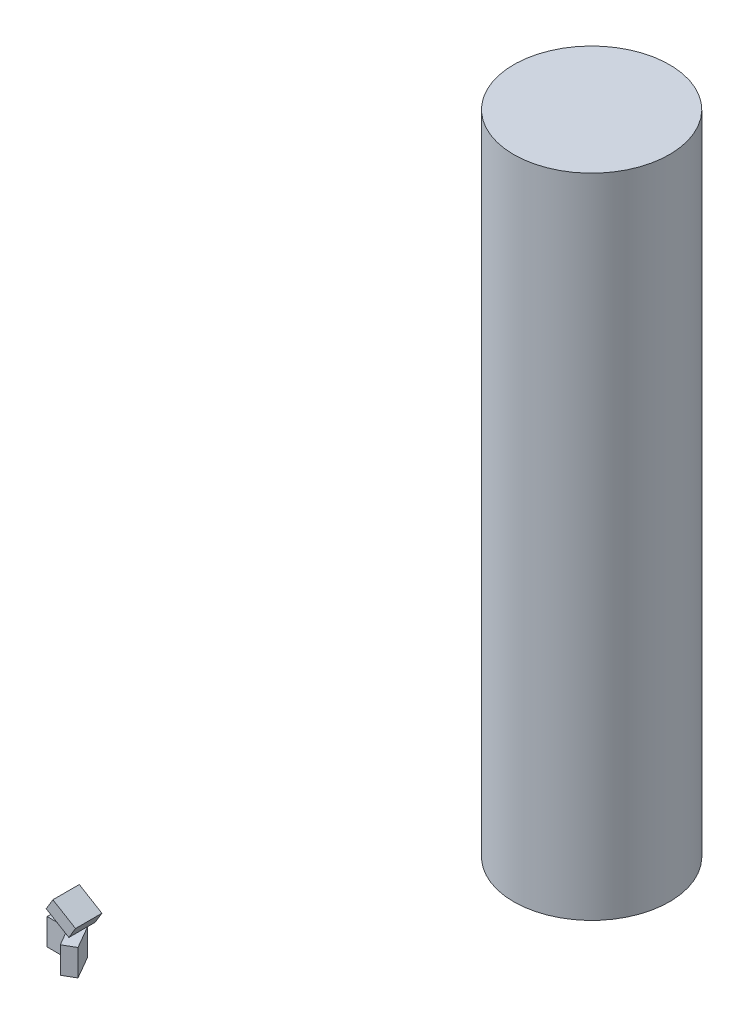
ISO-10303-21;
HEADER;
FILE_DESCRIPTION(('STEP AP214'),'2;1');
FILE_NAME('part.step','',(''),(''),'','','');
FILE_SCHEMA(('AUTOMOTIVE_DESIGN { 1 0 10303 214 1 1 1 1 }'));
ENDSEC;
DATA;
#1=APPLICATION_CONTEXT('core data for automotive mechanical design processes');
#2=APPLICATION_PROTOCOL_DEFINITION('international standard','automotive_design',2000,#1);
#3=PRODUCT_CONTEXT('',#1,'mechanical');
#4=PRODUCT('Part','Part','',(#3));
#5=PRODUCT_RELATED_PRODUCT_CATEGORY('part','',(#4));
#6=PRODUCT_DEFINITION_FORMATION('','',#4);
#7=PRODUCT_DEFINITION_CONTEXT('part definition',#1,'design');
#8=PRODUCT_DEFINITION('design','',#6,#7);
#9=PRODUCT_DEFINITION_SHAPE('','',#8);
#10=(LENGTH_UNIT() NAMED_UNIT(*) SI_UNIT(.MILLI.,.METRE.));
#11=(NAMED_UNIT(*) PLANE_ANGLE_UNIT() SI_UNIT($,.RADIAN.));
#12=(NAMED_UNIT(*) SI_UNIT($,.STERADIAN.) SOLID_ANGLE_UNIT());
#13=UNCERTAINTY_MEASURE_WITH_UNIT(LENGTH_MEASURE(1.E-05),#10,'distance_accuracy_value','');
#14=(GEOMETRIC_REPRESENTATION_CONTEXT(3) GLOBAL_UNCERTAINTY_ASSIGNED_CONTEXT((#13)) GLOBAL_UNIT_ASSIGNED_CONTEXT((#10,
#11,#12)) REPRESENTATION_CONTEXT('',''));
#15=CARTESIAN_POINT('',(0.,0.,0.));
#16=DIRECTION('',(0.,0.,1.));
#17=DIRECTION('',(1.,0.,0.));
#18=AXIS2_PLACEMENT_3D('',#15,#16,#17);
#19=CARTESIAN_POINT('',(-140.739076402305,35.2601091052999,249.607621135332));
#20=DIRECTION('',(0.,0.,1.));
#21=DIRECTION('',(1.,0.,0.));
#22=AXIS2_PLACEMENT_3D('',#19,#20,#21);
#23=PLANE('',#22);
#24=DIRECTION('',(-0.514495755427527,-0.857492925712544,0.));
#25=VECTOR('',#24,1.);
#26=CARTESIAN_POINT('',(-123.246220717769,24.7643956945783,249.607621135332));
#27=LINE('',#26,#25);
#28=CARTESIAN_POINT('',(-118.101263163494,33.3393249517038,249.607621135332));
#29=VERTEX_POINT('',#28);
#30=CARTESIAN_POINT('',(-123.246220717769,24.7643956945783,249.607621135332));
#31=VERTEX_POINT('',#30);
#32=EDGE_CURVE('E111',#29,#31,#27,.T.);
#33=ORIENTED_EDGE('',*,*,#32,.T.);
#34=DIRECTION('',(0.857492925712544,-0.514495755427527,0.));
#35=VECTOR('',#34,1.);
#36=CARTESIAN_POINT('',(-140.739076402305,35.2601091052999,249.607621135332));
#37=LINE('',#36,#35);
#38=CARTESIAN_POINT('',(-140.739076402305,35.2601091052999,249.607621135332));
#39=VERTEX_POINT('',#38);
#40=EDGE_CURVE('E12',#39,#31,#37,.T.);
#41=ORIENTED_EDGE('',*,*,#40,.F.);
#42=DIRECTION('',(-0.514495755427527,-0.857492925712544,0.));
#43=VECTOR('',#42,1.);
#44=CARTESIAN_POINT('',(-140.739076402305,35.2601091052999,249.607621135332));
#45=LINE('',#44,#43);
#46=CARTESIAN_POINT('',(-135.594118848029,43.8350383624253,249.607621135332));
#47=VERTEX_POINT('',#46);
#48=EDGE_CURVE('E99',#47,#39,#45,.T.);
#49=ORIENTED_EDGE('',*,*,#48,.F.);
#50=DIRECTION('',(0.857492925712544,-0.514495755427527,0.));
#51=VECTOR('',#50,1.);
#52=CARTESIAN_POINT('',(-135.594118848029,43.8350383624253,249.607621135332));
#53=LINE('',#52,#51);
#54=EDGE_CURVE('E107',#47,#29,#53,.T.);
#55=ORIENTED_EDGE('',*,*,#54,.T.);
#56=EDGE_LOOP('',(#33,#41,#49,#55));
#57=FACE_BOUND('',#56,.T.);
#58=ADVANCED_FACE('F48',(#57),#23,.F.);
#59=CARTESIAN_POINT('',(-140.739076402305,35.2601091052999,270.007621135332));
#60=DIRECTION('',(0.514495755427527,0.857492925712544,0.));
#61=DIRECTION('',(-0.857492925712544,0.514495755427527,0.));
#62=AXIS2_PLACEMENT_3D('',#59,#60,#61);
#63=PLANE('',#62);
#64=DIRECTION('',(0.,0.,1.));
#65=VECTOR('',#64,1.);
#66=CARTESIAN_POINT('',(-123.246220717769,24.7643956945783,270.007621135332));
#67=LINE('',#66,#65);
#68=CARTESIAN_POINT('',(-123.246220717769,24.7643956945783,270.007621135332));
#69=VERTEX_POINT('',#68);
#70=EDGE_CURVE('E103',#31,#69,#67,.T.);
#71=ORIENTED_EDGE('',*,*,#70,.T.);
#72=DIRECTION('',(0.857492925712544,-0.514495755427527,0.));
#73=VECTOR('',#72,1.);
#74=CARTESIAN_POINT('',(-140.739076402305,35.2601091052999,270.007621135332));
#75=LINE('',#74,#73);
#76=CARTESIAN_POINT('',(-140.739076402305,35.2601091052999,270.007621135332));
#77=VERTEX_POINT('',#76);
#78=EDGE_CURVE('E56',#77,#69,#75,.T.);
#79=ORIENTED_EDGE('',*,*,#78,.F.);
#80=DIRECTION('',(0.,0.,1.));
#81=VECTOR('',#80,1.);
#82=CARTESIAN_POINT('',(-140.739076402305,35.2601091052999,270.007621135332));
#83=LINE('',#82,#81);
#84=EDGE_CURVE('E94',#39,#77,#83,.T.);
#85=ORIENTED_EDGE('',*,*,#84,.F.);
#86=ORIENTED_EDGE('',*,*,#40,.T.);
#87=EDGE_LOOP('',(#71,#79,#85,#86));
#88=FACE_BOUND('',#87,.T.);
#89=ADVANCED_FACE('F102',(#88),#63,.F.);
#90=CARTESIAN_POINT('',(-135.594118848029,43.8350383624253,270.007621135332));
#91=DIRECTION('',(0.,0.,-1.));
#92=DIRECTION('',(-1.,0.,0.));
#93=AXIS2_PLACEMENT_3D('',#90,#91,#92);
#94=PLANE('',#93);
#95=DIRECTION('',(0.514495755427525,0.857492925712545,0.));
#96=VECTOR('',#95,1.);
#97=CARTESIAN_POINT('',(-118.101263163494,33.3393249517038,270.007621135332));
#98=LINE('',#97,#96);
#99=CARTESIAN_POINT('',(-118.101263163494,33.3393249517038,270.007621135332));
#100=VERTEX_POINT('',#99);
#101=EDGE_CURVE('E81',#69,#100,#98,.T.);
#102=ORIENTED_EDGE('',*,*,#101,.T.);
#103=DIRECTION('',(0.857492925712544,-0.514495755427527,0.));
#104=VECTOR('',#103,1.);
#105=CARTESIAN_POINT('',(-135.594118848029,43.8350383624253,270.007621135332));
#106=LINE('',#105,#104);
#107=CARTESIAN_POINT('',(-135.594118848029,43.8350383624253,270.007621135332));
#108=VERTEX_POINT('',#107);
#109=EDGE_CURVE('E104',#108,#100,#106,.T.);
#110=ORIENTED_EDGE('',*,*,#109,.F.);
#111=DIRECTION('',(0.514495755427525,0.857492925712545,0.));
#112=VECTOR('',#111,1.);
#113=CARTESIAN_POINT('',(-135.594118848029,43.8350383624253,270.007621135332));
#114=LINE('',#113,#112);
#115=EDGE_CURVE('E97',#77,#108,#114,.T.);
#116=ORIENTED_EDGE('',*,*,#115,.F.);
#117=ORIENTED_EDGE('',*,*,#78,.T.);
#118=EDGE_LOOP('',(#102,#110,#116,#117));
#119=FACE_BOUND('',#118,.T.);
#120=ADVANCED_FACE('F105',(#119),#94,.F.);
#121=CARTESIAN_POINT('',(-135.594118848029,43.8350383624253,249.607621135332));
#122=DIRECTION('',(-0.514495755427527,-0.857492925712544,0.));
#123=DIRECTION('',(0.857492925712544,-0.514495755427527,0.));
#124=AXIS2_PLACEMENT_3D('',#121,#122,#123);
#125=PLANE('',#124);
#126=DIRECTION('',(0.,0.,-1.));
#127=VECTOR('',#126,1.);
#128=CARTESIAN_POINT('',(-118.101263163494,33.3393249517038,249.607621135332));
#129=LINE('',#128,#127);
#130=EDGE_CURVE('E87',#100,#29,#129,.T.);
#131=ORIENTED_EDGE('',*,*,#130,.T.);
#132=ORIENTED_EDGE('',*,*,#54,.F.);
#133=DIRECTION('',(0.,0.,-1.));
#134=VECTOR('',#133,1.);
#135=CARTESIAN_POINT('',(-135.594118848029,43.8350383624253,249.607621135332));
#136=LINE('',#135,#134);
#137=EDGE_CURVE('E64',#108,#47,#136,.T.);
#138=ORIENTED_EDGE('',*,*,#137,.F.);
#139=ORIENTED_EDGE('',*,*,#109,.T.);
#140=EDGE_LOOP('',(#131,#132,#138,#139));
#141=FACE_BOUND('',#140,.T.);
#142=ADVANCED_FACE('F118',(#141),#125,.F.);
#143=CARTESIAN_POINT('',(-119.040545489327,71.4243272935961,-1.53800152067021E-13));
#144=DIRECTION('',(0.857492925712544,-0.514495755427527,0.));
#145=DIRECTION('',(0.514495755427527,0.857492925712544,0.));
#146=AXIS2_PLACEMENT_3D('',#143,#144,#145);
#147=PLANE('',#146);
#148=ORIENTED_EDGE('',*,*,#48,.T.);
#149=ORIENTED_EDGE('',*,*,#84,.T.);
#150=ORIENTED_EDGE('',*,*,#115,.T.);
#151=ORIENTED_EDGE('',*,*,#137,.T.);
#152=EDGE_LOOP('',(#148,#149,#150,#151));
#153=FACE_BOUND('',#152,.T.);
#154=ADVANCED_FACE('F95',(#153),#147,.F.);
#155=CARTESIAN_POINT('',(-101.547689804791,60.9286138828745,-1.46325016787098E-13));
#156=DIRECTION('',(0.857492925712544,-0.514495755427527,0.));
#157=DIRECTION('',(0.514495755427527,0.857492925712544,0.));
#158=AXIS2_PLACEMENT_3D('',#155,#156,#157);
#159=PLANE('',#158);
#160=ORIENTED_EDGE('',*,*,#32,.F.);
#161=ORIENTED_EDGE('',*,*,#130,.F.);
#162=ORIENTED_EDGE('',*,*,#101,.F.);
#163=ORIENTED_EDGE('',*,*,#70,.F.);
#164=EDGE_LOOP('',(#160,#161,#162,#163));
#165=FACE_BOUND('',#164,.T.);
#166=ADVANCED_FACE('F121',(#165),#159,.T.);
#167=CLOSED_SHELL('',(#58,#89,#120,#142,#154,#166));
#168=MANIFOLD_SOLID_BREP('B2',#167);
#169=CARTESIAN_POINT('',(-160.2,10.2,249.807621135332));
#170=DIRECTION('',(0.,0.,-1.));
#171=DIRECTION('',(-1.,0.,0.));
#172=AXIS2_PLACEMENT_3D('',#169,#170,#171);
#173=PLANE('',#172);
#174=DIRECTION('',(0.,-1.,0.));
#175=VECTOR('',#174,1.);
#176=CARTESIAN_POINT('',(-144.226497308104,10.2,249.807621135332));
#177=LINE('',#176,#175);
#178=CARTESIAN_POINT('',(-144.226497308104,10.2,249.807621135332));
#179=VERTEX_POINT('',#178);
#180=CARTESIAN_POINT('',(-144.226497308104,-10.2,249.807621135332));
#181=VERTEX_POINT('',#180);
#182=EDGE_CURVE('E205',#179,#181,#177,.T.);
#183=ORIENTED_EDGE('',*,*,#182,.F.);
#184=DIRECTION('',(1.,0.,0.));
#185=VECTOR('',#184,1.);
#186=CARTESIAN_POINT('',(-160.2,10.2,249.807621135332));
#187=LINE('',#186,#185);
#188=CARTESIAN_POINT('',(-160.2,10.2,249.807621135332));
#189=VERTEX_POINT('',#188);
#190=EDGE_CURVE('E300',#189,#179,#187,.T.);
#191=ORIENTED_EDGE('',*,*,#190,.F.);
#192=DIRECTION('',(0.,-1.,0.));
#193=VECTOR('',#192,1.);
#194=CARTESIAN_POINT('',(-160.2,10.2,249.807621135332));
#195=LINE('',#194,#193);
#196=CARTESIAN_POINT('',(-160.2,-10.2,249.807621135332));
#197=VERTEX_POINT('',#196);
#198=EDGE_CURVE('E190',#189,#197,#195,.T.);
#199=ORIENTED_EDGE('',*,*,#198,.T.);
#200=DIRECTION('',(1.,0.,0.));
#201=VECTOR('',#200,1.);
#202=CARTESIAN_POINT('',(-160.2,-10.2,249.807621135332));
#203=LINE('',#202,#201);
#204=EDGE_CURVE('E308',#197,#181,#203,.T.);
#205=ORIENTED_EDGE('',*,*,#204,.T.);
#206=EDGE_LOOP('',(#183,#191,#199,#205));
#207=FACE_BOUND('',#206,.T.);
#208=ADVANCED_FACE('F182',(#207),#173,.F.);
#209=CARTESIAN_POINT('',(-139.8,10.2,239.807621135332));
#210=DIRECTION('',(-1.,0.,0.));
#211=DIRECTION('',(0.,0.,1.));
#212=AXIS2_PLACEMENT_3D('',#209,#210,#211);
#213=PLANE('',#212);
#214=DIRECTION('',(0.,1.,0.));
#215=VECTOR('',#214,1.);
#216=CARTESIAN_POINT('',(-139.8,10.2,242.140702898129));
#217=LINE('',#216,#215);
#218=CARTESIAN_POINT('',(-139.8,-10.2,242.140702898129));
#219=VERTEX_POINT('',#218);
#220=CARTESIAN_POINT('',(-139.8,10.2,242.140702898129));
#221=VERTEX_POINT('',#220);
#222=EDGE_CURVE('E290',#219,#221,#217,.T.);
#223=ORIENTED_EDGE('',*,*,#222,.F.);
#224=DIRECTION('',(0.,0.,-1.));
#225=VECTOR('',#224,1.);
#226=CARTESIAN_POINT('',(-139.8,-10.2,239.807621135332));
#227=LINE('',#226,#225);
#228=CARTESIAN_POINT('',(-139.8,-10.2,239.807621135332));
#229=VERTEX_POINT('',#228);
#230=EDGE_CURVE('E298',#219,#229,#227,.T.);
#231=ORIENTED_EDGE('',*,*,#230,.T.);
#232=DIRECTION('',(0.,-1.,0.));
#233=VECTOR('',#232,1.);
#234=CARTESIAN_POINT('',(-139.8,10.2,239.807621135332));
#235=LINE('',#234,#233);
#236=CARTESIAN_POINT('',(-139.8,10.2,239.807621135332));
#237=VERTEX_POINT('',#236);
#238=EDGE_CURVE('E303',#237,#229,#235,.T.);
#239=ORIENTED_EDGE('',*,*,#238,.F.);
#240=DIRECTION('',(0.,0.,-1.));
#241=VECTOR('',#240,1.);
#242=CARTESIAN_POINT('',(-139.8,10.2,239.807621135332));
#243=LINE('',#242,#241);
#244=EDGE_CURVE('E197',#221,#237,#243,.T.);
#245=ORIENTED_EDGE('',*,*,#244,.F.);
#246=EDGE_LOOP('',(#223,#231,#239,#245));
#247=FACE_BOUND('',#246,.T.);
#248=ADVANCED_FACE('F325',(#247),#213,.F.);
#249=CARTESIAN_POINT('',(-139.8,10.2,239.807621135332));
#250=DIRECTION('',(0.,0.,1.));
#251=DIRECTION('',(1.,0.,0.));
#252=AXIS2_PLACEMENT_3D('',#249,#250,#251);
#253=PLANE('',#252);
#254=DIRECTION('',(-1.,0.,0.));
#255=VECTOR('',#254,1.);
#256=CARTESIAN_POINT('',(-139.8,-10.2,239.807621135332));
#257=LINE('',#256,#255);
#258=CARTESIAN_POINT('',(-160.2,-10.2,239.807621135332));
#259=VERTEX_POINT('',#258);
#260=EDGE_CURVE('E293',#229,#259,#257,.T.);
#261=ORIENTED_EDGE('',*,*,#260,.T.);
#262=DIRECTION('',(0.,-1.,0.));
#263=VECTOR('',#262,1.);
#264=CARTESIAN_POINT('',(-160.2,10.2,239.807621135332));
#265=LINE('',#264,#263);
#266=CARTESIAN_POINT('',(-160.2,10.2,239.807621135332));
#267=VERTEX_POINT('',#266);
#268=EDGE_CURVE('E46',#267,#259,#265,.T.);
#269=ORIENTED_EDGE('',*,*,#268,.F.);
#270=DIRECTION('',(-1.,0.,0.));
#271=VECTOR('',#270,1.);
#272=CARTESIAN_POINT('',(-139.8,10.2,239.807621135332));
#273=LINE('',#272,#271);
#274=EDGE_CURVE('E294',#237,#267,#273,.T.);
#275=ORIENTED_EDGE('',*,*,#274,.F.);
#276=ORIENTED_EDGE('',*,*,#238,.T.);
#277=EDGE_LOOP('',(#261,#269,#275,#276));
#278=FACE_BOUND('',#277,.T.);
#279=ADVANCED_FACE('F184',(#278),#253,.F.);
#280=CARTESIAN_POINT('',(-160.2,10.2,239.807621135332));
#281=DIRECTION('',(1.,0.,0.));
#282=DIRECTION('',(0.,0.,-1.));
#283=AXIS2_PLACEMENT_3D('',#280,#281,#282);
#284=PLANE('',#283);
#285=DIRECTION('',(0.,0.,1.));
#286=VECTOR('',#285,1.);
#287=CARTESIAN_POINT('',(-160.2,-10.2,239.807621135332));
#288=LINE('',#287,#286);
#289=EDGE_CURVE('E306',#259,#197,#288,.T.);
#290=ORIENTED_EDGE('',*,*,#289,.T.);
#291=ORIENTED_EDGE('',*,*,#198,.F.);
#292=DIRECTION('',(0.,0.,1.));
#293=VECTOR('',#292,1.);
#294=CARTESIAN_POINT('',(-160.2,10.2,239.807621135332));
#295=LINE('',#294,#293);
#296=EDGE_CURVE('E297',#267,#189,#295,.T.);
#297=ORIENTED_EDGE('',*,*,#296,.F.);
#298=ORIENTED_EDGE('',*,*,#268,.T.);
#299=EDGE_LOOP('',(#290,#291,#297,#298));
#300=FACE_BOUND('',#299,.T.);
#301=ADVANCED_FACE('F323',(#300),#284,.F.);
#302=CARTESIAN_POINT('',(0.,10.2,0.));
#303=DIRECTION('',(0.,1.,0.));
#304=DIRECTION('',(0.,0.,1.));
#305=AXIS2_PLACEMENT_3D('',#302,#303,#304);
#306=PLANE('',#305);
#307=ORIENTED_EDGE('',*,*,#190,.T.);
#308=DIRECTION('',(-0.5,0.,-0.866025403784438));
#309=VECTOR('',#308,1.);
#310=CARTESIAN_POINT('',(-136.239745962156,10.2,263.641080253933));
#311=LINE('',#310,#309);
#312=CARTESIAN_POINT('',(-136.239745962156,10.2,263.641080253933));
#313=VERTEX_POINT('',#312);
#314=EDGE_CURVE('E284',#313,#179,#311,.T.);
#315=ORIENTED_EDGE('',*,*,#314,.F.);
#316=DIRECTION('',(-0.866025403784439,0.,0.5));
#317=VECTOR('',#316,1.);
#318=CARTESIAN_POINT('',(-127.579491924311,10.2,258.641080253933));
#319=LINE('',#318,#317);
#320=CARTESIAN_POINT('',(-127.579491924311,10.2,258.641080253933));
#321=VERTEX_POINT('',#320);
#322=EDGE_CURVE('E280',#321,#313,#319,.T.);
#323=ORIENTED_EDGE('',*,*,#322,.F.);
#324=DIRECTION('',(0.5,0.,0.866025403784438));
#325=VECTOR('',#324,1.);
#326=CARTESIAN_POINT('',(-137.779491924311,10.2,240.97416201673));
#327=LINE('',#326,#325);
#328=CARTESIAN_POINT('',(-137.779491924311,10.2,240.97416201673));
#329=VERTEX_POINT('',#328);
#330=EDGE_CURVE('E269',#329,#321,#327,.T.);
#331=ORIENTED_EDGE('',*,*,#330,.F.);
#332=DIRECTION('',(0.866025403784439,0.,-0.5));
#333=VECTOR('',#332,1.);
#334=CARTESIAN_POINT('',(-137.779491924311,10.2,240.97416201673));
#335=LINE('',#334,#333);
#336=EDGE_CURVE('E288',#221,#329,#335,.T.);
#337=ORIENTED_EDGE('',*,*,#336,.F.);
#338=ORIENTED_EDGE('',*,*,#244,.T.);
#339=ORIENTED_EDGE('',*,*,#274,.T.);
#340=ORIENTED_EDGE('',*,*,#296,.T.);
#341=EDGE_LOOP('',(#307,#315,#323,#331,#337,#338,#339,#340));
#342=FACE_BOUND('',#341,.T.);
#343=ADVANCED_FACE('F320',(#342),#306,.T.);
#344=CARTESIAN_POINT('',(0.,-10.2,0.));
#345=DIRECTION('',(0.,1.,0.));
#346=DIRECTION('',(0.,0.,1.));
#347=AXIS2_PLACEMENT_3D('',#344,#345,#346);
#348=PLANE('',#347);
#349=DIRECTION('',(-0.5,0.,-0.866025403784438));
#350=VECTOR('',#349,1.);
#351=CARTESIAN_POINT('',(-136.239745962156,-10.2,263.641080253933));
#352=LINE('',#351,#350);
#353=CARTESIAN_POINT('',(-136.239745962156,-10.2,263.641080253933));
#354=VERTEX_POINT('',#353);
#355=EDGE_CURVE('E282',#354,#181,#352,.T.);
#356=ORIENTED_EDGE('',*,*,#355,.T.);
#357=ORIENTED_EDGE('',*,*,#204,.F.);
#358=ORIENTED_EDGE('',*,*,#289,.F.);
#359=ORIENTED_EDGE('',*,*,#260,.F.);
#360=ORIENTED_EDGE('',*,*,#230,.F.);
#361=DIRECTION('',(0.866025403784439,0.,-0.5));
#362=VECTOR('',#361,1.);
#363=CARTESIAN_POINT('',(-137.779491924311,-10.2,240.97416201673));
#364=LINE('',#363,#362);
#365=CARTESIAN_POINT('',(-137.779491924311,-10.2,240.97416201673));
#366=VERTEX_POINT('',#365);
#367=EDGE_CURVE('E273',#219,#366,#364,.T.);
#368=ORIENTED_EDGE('',*,*,#367,.T.);
#369=DIRECTION('',(0.5,0.,0.866025403784438));
#370=VECTOR('',#369,1.);
#371=CARTESIAN_POINT('',(-137.779491924311,-10.2,240.97416201673));
#372=LINE('',#371,#370);
#373=CARTESIAN_POINT('',(-127.579491924311,-10.2,258.641080253933));
#374=VERTEX_POINT('',#373);
#375=EDGE_CURVE('E267',#366,#374,#372,.T.);
#376=ORIENTED_EDGE('',*,*,#375,.T.);
#377=DIRECTION('',(-0.866025403784439,0.,0.5));
#378=VECTOR('',#377,1.);
#379=CARTESIAN_POINT('',(-127.579491924311,-10.2,258.641080253933));
#380=LINE('',#379,#378);
#381=EDGE_CURVE('E250',#374,#354,#380,.T.);
#382=ORIENTED_EDGE('',*,*,#381,.T.);
#383=EDGE_LOOP('',(#356,#357,#358,#359,#360,#368,#376,#382));
#384=FACE_BOUND('',#383,.T.);
#385=ADVANCED_FACE('F271',(#384),#348,.F.);
#386=CARTESIAN_POINT('',(-136.239745962156,10.2,263.641080253933));
#387=DIRECTION('',(0.866025403784439,0.,-0.5));
#388=DIRECTION('',(0.5,0.,0.866025403784438));
#389=AXIS2_PLACEMENT_3D('',#386,#387,#388);
#390=PLANE('',#389);
#391=ORIENTED_EDGE('',*,*,#314,.T.);
#392=ORIENTED_EDGE('',*,*,#182,.T.);
#393=ORIENTED_EDGE('',*,*,#355,.F.);
#394=DIRECTION('',(0.,-1.,0.));
#395=VECTOR('',#394,1.);
#396=CARTESIAN_POINT('',(-136.239745962156,10.2,263.641080253933));
#397=LINE('',#396,#395);
#398=EDGE_CURVE('E257',#313,#354,#397,.T.);
#399=ORIENTED_EDGE('',*,*,#398,.F.);
#400=EDGE_LOOP('',(#391,#392,#393,#399));
#401=FACE_BOUND('',#400,.T.);
#402=ADVANCED_FACE('F318',(#401),#390,.F.);
#403=CARTESIAN_POINT('',(-137.779491924311,10.2,240.97416201673));
#404=DIRECTION('',(0.5,0.,0.866025403784438));
#405=DIRECTION('',(-0.866025403784439,0.,0.5));
#406=AXIS2_PLACEMENT_3D('',#403,#404,#405);
#407=PLANE('',#406);
#408=ORIENTED_EDGE('',*,*,#367,.F.);
#409=ORIENTED_EDGE('',*,*,#222,.T.);
#410=ORIENTED_EDGE('',*,*,#336,.T.);
#411=DIRECTION('',(0.,-1.,0.));
#412=VECTOR('',#411,1.);
#413=CARTESIAN_POINT('',(-137.779491924311,10.2,240.97416201673));
#414=LINE('',#413,#412);
#415=EDGE_CURVE('E261',#329,#366,#414,.T.);
#416=ORIENTED_EDGE('',*,*,#415,.T.);
#417=EDGE_LOOP('',(#408,#409,#410,#416));
#418=FACE_BOUND('',#417,.T.);
#419=ADVANCED_FACE('F328',(#418),#407,.F.);
#420=CARTESIAN_POINT('',(-137.779491924311,10.2,240.97416201673));
#421=DIRECTION('',(-0.866025403784439,0.,0.5));
#422=DIRECTION('',(-0.5,0.,-0.866025403784438));
#423=AXIS2_PLACEMENT_3D('',#420,#421,#422);
#424=PLANE('',#423);
#425=ORIENTED_EDGE('',*,*,#375,.F.);
#426=ORIENTED_EDGE('',*,*,#415,.F.);
#427=ORIENTED_EDGE('',*,*,#330,.T.);
#428=DIRECTION('',(0.,-1.,0.));
#429=VECTOR('',#428,1.);
#430=CARTESIAN_POINT('',(-127.579491924311,10.2,258.641080253933));
#431=LINE('',#430,#429);
#432=EDGE_CURVE('E254',#321,#374,#431,.T.);
#433=ORIENTED_EDGE('',*,*,#432,.T.);
#434=EDGE_LOOP('',(#425,#426,#427,#433));
#435=FACE_BOUND('',#434,.T.);
#436=ADVANCED_FACE('F265',(#435),#424,.F.);
#437=CARTESIAN_POINT('',(-127.579491924311,10.2,258.641080253933));
#438=DIRECTION('',(-0.5,0.,-0.866025403784438));
#439=DIRECTION('',(0.866025403784439,0.,-0.5));
#440=AXIS2_PLACEMENT_3D('',#437,#438,#439);
#441=PLANE('',#440);
#442=ORIENTED_EDGE('',*,*,#381,.F.);
#443=ORIENTED_EDGE('',*,*,#432,.F.);
#444=ORIENTED_EDGE('',*,*,#322,.T.);
#445=ORIENTED_EDGE('',*,*,#398,.T.);
#446=EDGE_LOOP('',(#442,#443,#444,#445));
#447=FACE_BOUND('',#446,.T.);
#448=ADVANCED_FACE('F252',(#447),#441,.F.);
#449=CLOSED_SHELL('',(#208,#248,#279,#301,#343,#385,#402,#419,#436,#448));
#450=MANIFOLD_SOLID_BREP('B6',#449);
#451=CARTESIAN_POINT('',(0.,500.,-10.6487865683107));
#452=DIRECTION('',(0.,-1.,0.));
#453=DIRECTION('',(0.,0.,-1.));
#454=AXIS2_PLACEMENT_3D('',#451,#452,#453);
#455=CYLINDRICAL_SURFACE('',#454,60.1873477068793);
#456=CARTESIAN_POINT('',(0.,500.,-10.6487865683107));
#457=DIRECTION('',(0.,1.,0.));
#458=DIRECTION('',(0.,0.,1.));
#459=AXIS2_PLACEMENT_3D('',#456,#457,#458);
#460=CIRCLE('',#459,60.1873477068793);
#461=CARTESIAN_POINT('',(0.,500.,49.5385611385686));
#462=VERTEX_POINT('',#461);
#463=EDGE_CURVE('E417',#462,#462,#460,.T.);
#464=ORIENTED_EDGE('',*,*,#463,.F.);
#465=EDGE_LOOP('',(#464));
#466=FACE_BOUND('',#465,.T.);
#467=CARTESIAN_POINT('',(0.,0.,-10.6487865683107));
#468=DIRECTION('',(0.,1.,0.));
#469=DIRECTION('',(0.,0.,1.));
#470=AXIS2_PLACEMENT_3D('',#467,#468,#469);
#471=CIRCLE('',#470,60.1873477068793);
#472=CARTESIAN_POINT('',(0.,0.,49.5385611385686));
#473=VERTEX_POINT('',#472);
#474=EDGE_CURVE('E465',#473,#473,#471,.T.);
#475=ORIENTED_EDGE('',*,*,#474,.T.);
#476=EDGE_LOOP('',(#475));
#477=FACE_BOUND('',#476,.T.);
#478=ADVANCED_FACE('F462',(#466,#477),#455,.T.);
#479=CARTESIAN_POINT('',(0.,500.,-10.6487865683107));
#480=DIRECTION('',(0.,1.,0.));
#481=DIRECTION('',(0.,0.,1.));
#482=AXIS2_PLACEMENT_3D('',#479,#480,#481);
#483=PLANE('',#482);
#484=ORIENTED_EDGE('',*,*,#463,.T.);
#485=EDGE_LOOP('',(#484));
#486=FACE_BOUND('',#485,.T.);
#487=ADVANCED_FACE('F477',(#486),#483,.T.);
#488=CARTESIAN_POINT('',(0.,0.,-10.6487865683107));
#489=DIRECTION('',(0.,1.,0.));
#490=DIRECTION('',(0.,0.,1.));
#491=AXIS2_PLACEMENT_3D('',#488,#489,#490);
#492=PLANE('',#491);
#493=ORIENTED_EDGE('',*,*,#474,.F.);
#494=EDGE_LOOP('',(#493));
#495=FACE_BOUND('',#494,.T.);
#496=ADVANCED_FACE('F475',(#495),#492,.F.);
#497=CLOSED_SHELL('',(#478,#487,#496));
#498=MANIFOLD_SOLID_BREP('B174_NOT_SHOWN',#497);
#499=ADVANCED_BREP_SHAPE_REPRESENTATION('',(#18,#168,#450,#498),#14);
#500=SHAPE_DEFINITION_REPRESENTATION(#9,#499);
ENDSEC;
END-ISO-10303-21;
